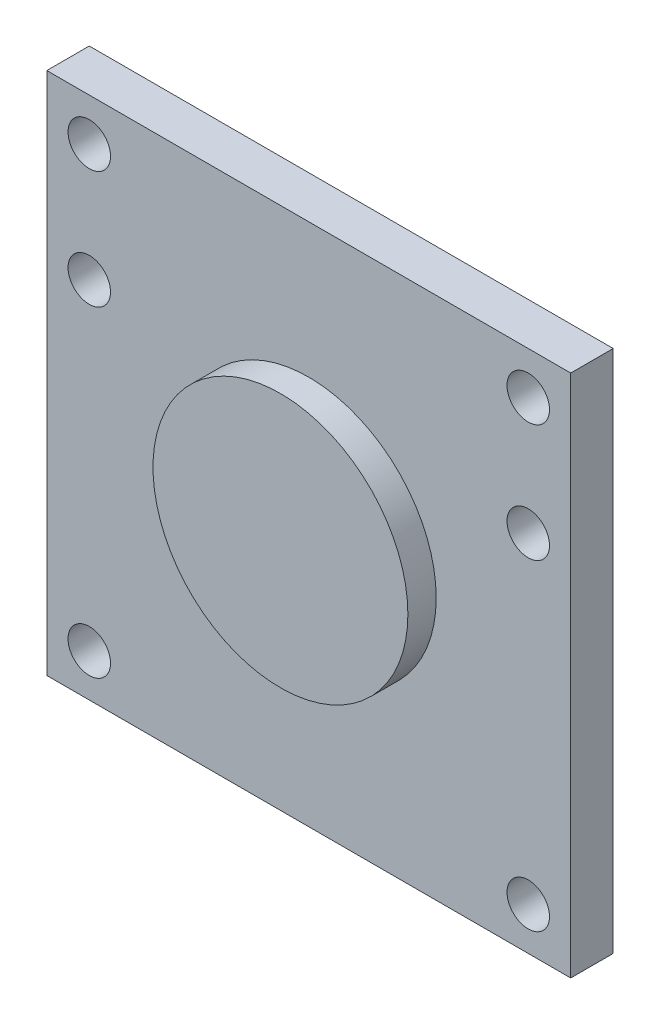
ISO-10303-21;
HEADER;
FILE_DESCRIPTION(('STEP AP214'),'2;1');
FILE_NAME('part.step','',(''),(''),'','','');
FILE_SCHEMA(('AUTOMOTIVE_DESIGN { 1 0 10303 214 1 1 1 1 }'));
ENDSEC;
DATA;
#1=APPLICATION_CONTEXT('core data for automotive mechanical design processes');
#2=APPLICATION_PROTOCOL_DEFINITION('international standard','automotive_design',2000,#1);
#3=PRODUCT_CONTEXT('',#1,'mechanical');
#4=PRODUCT('Part','Part','',(#3));
#5=PRODUCT_RELATED_PRODUCT_CATEGORY('part','',(#4));
#6=PRODUCT_DEFINITION_FORMATION('','',#4);
#7=PRODUCT_DEFINITION_CONTEXT('part definition',#1,'design');
#8=PRODUCT_DEFINITION('design','',#6,#7);
#9=PRODUCT_DEFINITION_SHAPE('','',#8);
#10=(LENGTH_UNIT() NAMED_UNIT(*) SI_UNIT(.MILLI.,.METRE.));
#11=(NAMED_UNIT(*) PLANE_ANGLE_UNIT() SI_UNIT($,.RADIAN.));
#12=(NAMED_UNIT(*) SI_UNIT($,.STERADIAN.) SOLID_ANGLE_UNIT());
#13=UNCERTAINTY_MEASURE_WITH_UNIT(LENGTH_MEASURE(1.E-05),#10,'distance_accuracy_value','');
#14=(GEOMETRIC_REPRESENTATION_CONTEXT(3) GLOBAL_UNCERTAINTY_ASSIGNED_CONTEXT((#13)) GLOBAL_UNIT_ASSIGNED_CONTEXT((#10,
#11,#12)) REPRESENTATION_CONTEXT('',''));
#15=CARTESIAN_POINT('',(0.,0.,0.));
#16=DIRECTION('',(0.,0.,1.));
#17=DIRECTION('',(1.,0.,0.));
#18=AXIS2_PLACEMENT_3D('',#15,#16,#17);
#19=CARTESIAN_POINT('',(0.,0.,3.));
#20=DIRECTION('',(0.,0.,1.));
#21=DIRECTION('',(1.,0.,0.));
#22=AXIS2_PLACEMENT_3D('',#19,#20,#21);
#23=PLANE('',#22);
#24=CARTESIAN_POINT('',(0.,0.,3.));
#25=DIRECTION('',(0.,0.,1.));
#26=DIRECTION('',(1.,0.,0.));
#27=AXIS2_PLACEMENT_3D('',#24,#25,#26);
#28=CIRCLE('',#27,9.);
#29=CARTESIAN_POINT('',(9.,0.,3.));
#30=VERTEX_POINT('',#29);
#31=EDGE_CURVE('E150',#30,#30,#28,.T.);
#32=ORIENTED_EDGE('',*,*,#31,.F.);
#33=EDGE_LOOP('',(#32));
#34=FACE_BOUND('',#33,.T.);
#35=CARTESIAN_POINT('',(15.5,-15.5,3.));
#36=DIRECTION('',(0.,0.,1.));
#37=DIRECTION('',(1.,0.,0.));
#38=AXIS2_PLACEMENT_3D('',#35,#36,#37);
#39=CIRCLE('',#38,1.5);
#40=CARTESIAN_POINT('',(17.,-15.5,3.));
#41=VERTEX_POINT('',#40);
#42=EDGE_CURVE('E135',#41,#41,#39,.T.);
#43=ORIENTED_EDGE('',*,*,#42,.F.);
#44=EDGE_LOOP('',(#43));
#45=FACE_BOUND('',#44,.T.);
#46=CARTESIAN_POINT('',(-15.5,15.5,3.));
#47=DIRECTION('',(0.,0.,1.));
#48=DIRECTION('',(1.,0.,0.));
#49=AXIS2_PLACEMENT_3D('',#46,#47,#48);
#50=CIRCLE('',#49,1.5);
#51=CARTESIAN_POINT('',(-14.,15.5,3.));
#52=VERTEX_POINT('',#51);
#53=EDGE_CURVE('E123',#52,#52,#50,.T.);
#54=ORIENTED_EDGE('',*,*,#53,.F.);
#55=EDGE_LOOP('',(#54));
#56=FACE_BOUND('',#55,.T.);
#57=CARTESIAN_POINT('',(15.5,7.2,3.));
#58=DIRECTION('',(0.,0.,1.));
#59=DIRECTION('',(1.,0.,0.));
#60=AXIS2_PLACEMENT_3D('',#57,#58,#59);
#61=CIRCLE('',#60,1.5);
#62=CARTESIAN_POINT('',(17.,7.2,3.));
#63=VERTEX_POINT('',#62);
#64=EDGE_CURVE('E102',#63,#63,#61,.T.);
#65=ORIENTED_EDGE('',*,*,#64,.F.);
#66=EDGE_LOOP('',(#65));
#67=FACE_BOUND('',#66,.T.);
#68=DIRECTION('',(0.,1.,0.));
#69=VECTOR('',#68,1.);
#70=CARTESIAN_POINT('',(18.5,18.5,3.));
#71=LINE('',#70,#69);
#72=CARTESIAN_POINT('',(18.5,-18.5,3.));
#73=VERTEX_POINT('',#72);
#74=CARTESIAN_POINT('',(18.5,18.5,3.));
#75=VERTEX_POINT('',#74);
#76=EDGE_CURVE('E87',#73,#75,#71,.T.);
#77=ORIENTED_EDGE('',*,*,#76,.T.);
#78=DIRECTION('',(-1.,0.,0.));
#79=VECTOR('',#78,1.);
#80=CARTESIAN_POINT('',(-18.5,18.5,3.));
#81=LINE('',#80,#79);
#82=CARTESIAN_POINT('',(-18.5,18.5,3.));
#83=VERTEX_POINT('',#82);
#84=EDGE_CURVE('E82',#75,#83,#81,.T.);
#85=ORIENTED_EDGE('',*,*,#84,.T.);
#86=DIRECTION('',(0.,-1.,0.));
#87=VECTOR('',#86,1.);
#88=CARTESIAN_POINT('',(-18.5,18.5,3.));
#89=LINE('',#88,#87);
#90=CARTESIAN_POINT('',(-18.5,-18.5,3.));
#91=VERTEX_POINT('',#90);
#92=EDGE_CURVE('E85',#83,#91,#89,.T.);
#93=ORIENTED_EDGE('',*,*,#92,.T.);
#94=DIRECTION('',(1.,0.,0.));
#95=VECTOR('',#94,1.);
#96=CARTESIAN_POINT('',(-18.5,-18.5,3.));
#97=LINE('',#96,#95);
#98=EDGE_CURVE('E52',#91,#73,#97,.T.);
#99=ORIENTED_EDGE('',*,*,#98,.T.);
#100=EDGE_LOOP('',(#77,#85,#93,#99));
#101=FACE_BOUND('',#100,.T.);
#102=CARTESIAN_POINT('',(-15.5,7.2,3.));
#103=DIRECTION('',(0.,0.,1.));
#104=DIRECTION('',(1.,0.,0.));
#105=AXIS2_PLACEMENT_3D('',#102,#103,#104);
#106=CIRCLE('',#105,1.5);
#107=CARTESIAN_POINT('',(-14.,7.2,3.));
#108=VERTEX_POINT('',#107);
#109=EDGE_CURVE('E117',#108,#108,#106,.T.);
#110=ORIENTED_EDGE('',*,*,#109,.F.);
#111=EDGE_LOOP('',(#110));
#112=FACE_BOUND('',#111,.T.);
#113=CARTESIAN_POINT('',(15.5,15.5,3.));
#114=DIRECTION('',(0.,0.,1.));
#115=DIRECTION('',(1.,0.,0.));
#116=AXIS2_PLACEMENT_3D('',#113,#114,#115);
#117=CIRCLE('',#116,1.5);
#118=CARTESIAN_POINT('',(17.,15.5,3.));
#119=VERTEX_POINT('',#118);
#120=EDGE_CURVE('E129',#119,#119,#117,.T.);
#121=ORIENTED_EDGE('',*,*,#120,.F.);
#122=EDGE_LOOP('',(#121));
#123=FACE_BOUND('',#122,.T.);
#124=CARTESIAN_POINT('',(-15.5,-15.5,3.));
#125=DIRECTION('',(0.,0.,1.));
#126=DIRECTION('',(1.,0.,0.));
#127=AXIS2_PLACEMENT_3D('',#124,#125,#126);
#128=CIRCLE('',#127,1.5);
#129=CARTESIAN_POINT('',(-14.,-15.5,3.));
#130=VERTEX_POINT('',#129);
#131=EDGE_CURVE('E141',#130,#130,#128,.T.);
#132=ORIENTED_EDGE('',*,*,#131,.F.);
#133=EDGE_LOOP('',(#132));
#134=FACE_BOUND('',#133,.T.);
#135=ADVANCED_FACE('F35',(#34,#45,#56,#67,#101,#112,#123,#134),#23,.T.);
#136=CARTESIAN_POINT('',(0.,0.,0.));
#137=DIRECTION('',(0.,0.,1.));
#138=DIRECTION('',(1.,0.,0.));
#139=AXIS2_PLACEMENT_3D('',#136,#137,#138);
#140=PLANE('',#139);
#141=DIRECTION('',(0.,1.,0.));
#142=VECTOR('',#141,1.);
#143=CARTESIAN_POINT('',(18.5,18.5,0.));
#144=LINE('',#143,#142);
#145=CARTESIAN_POINT('',(18.5,-18.5,0.));
#146=VERTEX_POINT('',#145);
#147=CARTESIAN_POINT('',(18.5,18.5,0.));
#148=VERTEX_POINT('',#147);
#149=EDGE_CURVE('E99',#146,#148,#144,.T.);
#150=ORIENTED_EDGE('',*,*,#149,.F.);
#151=DIRECTION('',(1.,0.,0.));
#152=VECTOR('',#151,1.);
#153=CARTESIAN_POINT('',(-18.5,-18.5,0.));
#154=LINE('',#153,#152);
#155=CARTESIAN_POINT('',(-18.5,-18.5,0.));
#156=VERTEX_POINT('',#155);
#157=EDGE_CURVE('E75',#156,#146,#154,.T.);
#158=ORIENTED_EDGE('',*,*,#157,.F.);
#159=DIRECTION('',(0.,-1.,0.));
#160=VECTOR('',#159,1.);
#161=CARTESIAN_POINT('',(-18.5,18.5,0.));
#162=LINE('',#161,#160);
#163=CARTESIAN_POINT('',(-18.5,18.5,0.));
#164=VERTEX_POINT('',#163);
#165=EDGE_CURVE('E69',#164,#156,#162,.T.);
#166=ORIENTED_EDGE('',*,*,#165,.F.);
#167=DIRECTION('',(-1.,0.,0.));
#168=VECTOR('',#167,1.);
#169=CARTESIAN_POINT('',(-18.5,18.5,0.));
#170=LINE('',#169,#168);
#171=EDGE_CURVE('E91',#148,#164,#170,.T.);
#172=ORIENTED_EDGE('',*,*,#171,.F.);
#173=EDGE_LOOP('',(#150,#158,#166,#172));
#174=FACE_BOUND('',#173,.T.);
#175=CARTESIAN_POINT('',(15.5,7.2,0.));
#176=DIRECTION('',(0.,0.,1.));
#177=DIRECTION('',(1.,0.,0.));
#178=AXIS2_PLACEMENT_3D('',#175,#176,#177);
#179=CIRCLE('',#178,1.5);
#180=CARTESIAN_POINT('',(17.,7.2,0.));
#181=VERTEX_POINT('',#180);
#182=EDGE_CURVE('E114',#181,#181,#179,.T.);
#183=ORIENTED_EDGE('',*,*,#182,.T.);
#184=EDGE_LOOP('',(#183));
#185=FACE_BOUND('',#184,.T.);
#186=CARTESIAN_POINT('',(-15.5,7.2,0.));
#187=DIRECTION('',(0.,0.,1.));
#188=DIRECTION('',(1.,0.,0.));
#189=AXIS2_PLACEMENT_3D('',#186,#187,#188);
#190=CIRCLE('',#189,1.5);
#191=CARTESIAN_POINT('',(-14.,7.2,0.));
#192=VERTEX_POINT('',#191);
#193=EDGE_CURVE('E120',#192,#192,#190,.T.);
#194=ORIENTED_EDGE('',*,*,#193,.T.);
#195=EDGE_LOOP('',(#194));
#196=FACE_BOUND('',#195,.T.);
#197=CARTESIAN_POINT('',(-15.5,15.5,0.));
#198=DIRECTION('',(0.,0.,1.));
#199=DIRECTION('',(1.,0.,0.));
#200=AXIS2_PLACEMENT_3D('',#197,#198,#199);
#201=CIRCLE('',#200,1.5);
#202=CARTESIAN_POINT('',(-14.,15.5,0.));
#203=VERTEX_POINT('',#202);
#204=EDGE_CURVE('E126',#203,#203,#201,.T.);
#205=ORIENTED_EDGE('',*,*,#204,.T.);
#206=EDGE_LOOP('',(#205));
#207=FACE_BOUND('',#206,.T.);
#208=CARTESIAN_POINT('',(15.5,15.5,0.));
#209=DIRECTION('',(0.,0.,1.));
#210=DIRECTION('',(1.,0.,0.));
#211=AXIS2_PLACEMENT_3D('',#208,#209,#210);
#212=CIRCLE('',#211,1.5);
#213=CARTESIAN_POINT('',(17.,15.5,0.));
#214=VERTEX_POINT('',#213);
#215=EDGE_CURVE('E132',#214,#214,#212,.T.);
#216=ORIENTED_EDGE('',*,*,#215,.T.);
#217=EDGE_LOOP('',(#216));
#218=FACE_BOUND('',#217,.T.);
#219=CARTESIAN_POINT('',(15.5,-15.5,0.));
#220=DIRECTION('',(0.,0.,1.));
#221=DIRECTION('',(1.,0.,0.));
#222=AXIS2_PLACEMENT_3D('',#219,#220,#221);
#223=CIRCLE('',#222,1.5);
#224=CARTESIAN_POINT('',(17.,-15.5,0.));
#225=VERTEX_POINT('',#224);
#226=EDGE_CURVE('E138',#225,#225,#223,.T.);
#227=ORIENTED_EDGE('',*,*,#226,.T.);
#228=EDGE_LOOP('',(#227));
#229=FACE_BOUND('',#228,.T.);
#230=CARTESIAN_POINT('',(-15.5,-15.5,0.));
#231=DIRECTION('',(0.,0.,1.));
#232=DIRECTION('',(1.,0.,0.));
#233=AXIS2_PLACEMENT_3D('',#230,#231,#232);
#234=CIRCLE('',#233,1.5);
#235=CARTESIAN_POINT('',(-14.,-15.5,0.));
#236=VERTEX_POINT('',#235);
#237=EDGE_CURVE('E144',#236,#236,#234,.T.);
#238=ORIENTED_EDGE('',*,*,#237,.T.);
#239=EDGE_LOOP('',(#238));
#240=FACE_BOUND('',#239,.T.);
#241=ADVANCED_FACE('F110',(#174,#185,#196,#207,#218,#229,#240),#140,.F.);
#242=CARTESIAN_POINT('',(18.5,18.5,3.));
#243=DIRECTION('',(-1.,0.,0.));
#244=DIRECTION('',(0.,0.,1.));
#245=AXIS2_PLACEMENT_3D('',#242,#243,#244);
#246=PLANE('',#245);
#247=ORIENTED_EDGE('',*,*,#149,.T.);
#248=DIRECTION('',(0.,0.,-1.));
#249=VECTOR('',#248,1.);
#250=CARTESIAN_POINT('',(18.5,18.5,3.));
#251=LINE('',#250,#249);
#252=EDGE_CURVE('E11',#75,#148,#251,.T.);
#253=ORIENTED_EDGE('',*,*,#252,.F.);
#254=ORIENTED_EDGE('',*,*,#76,.F.);
#255=DIRECTION('',(0.,0.,-1.));
#256=VECTOR('',#255,1.);
#257=CARTESIAN_POINT('',(18.5,-18.5,3.));
#258=LINE('',#257,#256);
#259=EDGE_CURVE('E95',#73,#146,#258,.T.);
#260=ORIENTED_EDGE('',*,*,#259,.T.);
#261=EDGE_LOOP('',(#247,#253,#254,#260));
#262=FACE_BOUND('',#261,.T.);
#263=ADVANCED_FACE('F37',(#262),#246,.F.);
#264=CARTESIAN_POINT('',(-18.5,18.5,3.));
#265=DIRECTION('',(0.,-1.,0.));
#266=DIRECTION('',(0.,0.,-1.));
#267=AXIS2_PLACEMENT_3D('',#264,#265,#266);
#268=PLANE('',#267);
#269=ORIENTED_EDGE('',*,*,#171,.T.);
#270=DIRECTION('',(0.,0.,-1.));
#271=VECTOR('',#270,1.);
#272=CARTESIAN_POINT('',(-18.5,18.5,3.));
#273=LINE('',#272,#271);
#274=EDGE_CURVE('E44',#83,#164,#273,.T.);
#275=ORIENTED_EDGE('',*,*,#274,.F.);
#276=ORIENTED_EDGE('',*,*,#84,.F.);
#277=ORIENTED_EDGE('',*,*,#252,.T.);
#278=EDGE_LOOP('',(#269,#275,#276,#277));
#279=FACE_BOUND('',#278,.T.);
#280=ADVANCED_FACE('F90',(#279),#268,.F.);
#281=CARTESIAN_POINT('',(-18.5,18.5,3.));
#282=DIRECTION('',(1.,0.,0.));
#283=DIRECTION('',(0.,1.,0.));
#284=AXIS2_PLACEMENT_3D('',#281,#282,#283);
#285=PLANE('',#284);
#286=ORIENTED_EDGE('',*,*,#165,.T.);
#287=DIRECTION('',(0.,0.,-1.));
#288=VECTOR('',#287,1.);
#289=CARTESIAN_POINT('',(-18.5,-18.5,3.));
#290=LINE('',#289,#288);
#291=EDGE_CURVE('E92',#91,#156,#290,.T.);
#292=ORIENTED_EDGE('',*,*,#291,.F.);
#293=ORIENTED_EDGE('',*,*,#92,.F.);
#294=ORIENTED_EDGE('',*,*,#274,.T.);
#295=EDGE_LOOP('',(#286,#292,#293,#294));
#296=FACE_BOUND('',#295,.T.);
#297=ADVANCED_FACE('F93',(#296),#285,.F.);
#298=CARTESIAN_POINT('',(-18.5,-18.5,3.));
#299=DIRECTION('',(0.,1.,0.));
#300=DIRECTION('',(0.,0.,1.));
#301=AXIS2_PLACEMENT_3D('',#298,#299,#300);
#302=PLANE('',#301);
#303=ORIENTED_EDGE('',*,*,#157,.T.);
#304=ORIENTED_EDGE('',*,*,#259,.F.);
#305=ORIENTED_EDGE('',*,*,#98,.F.);
#306=ORIENTED_EDGE('',*,*,#291,.T.);
#307=EDGE_LOOP('',(#303,#304,#305,#306));
#308=FACE_BOUND('',#307,.T.);
#309=ADVANCED_FACE('F107',(#308),#302,.F.);
#310=CARTESIAN_POINT('',(15.5,7.2,3.));
#311=DIRECTION('',(0.,0.,-1.));
#312=DIRECTION('',(-1.,0.,0.));
#313=AXIS2_PLACEMENT_3D('',#310,#311,#312);
#314=CYLINDRICAL_SURFACE('',#313,1.5);
#315=ORIENTED_EDGE('',*,*,#64,.T.);
#316=EDGE_LOOP('',(#315));
#317=FACE_BOUND('',#316,.T.);
#318=ORIENTED_EDGE('',*,*,#182,.F.);
#319=EDGE_LOOP('',(#318));
#320=FACE_BOUND('',#319,.T.);
#321=ADVANCED_FACE('F174',(#317,#320),#314,.F.);
#322=CARTESIAN_POINT('',(-15.5,7.2,3.));
#323=DIRECTION('',(0.,0.,-1.));
#324=DIRECTION('',(-1.,0.,0.));
#325=AXIS2_PLACEMENT_3D('',#322,#323,#324);
#326=CYLINDRICAL_SURFACE('',#325,1.5);
#327=ORIENTED_EDGE('',*,*,#109,.T.);
#328=EDGE_LOOP('',(#327));
#329=FACE_BOUND('',#328,.T.);
#330=ORIENTED_EDGE('',*,*,#193,.F.);
#331=EDGE_LOOP('',(#330));
#332=FACE_BOUND('',#331,.T.);
#333=ADVANCED_FACE('F177',(#329,#332),#326,.F.);
#334=CARTESIAN_POINT('',(-15.5,15.5,3.));
#335=DIRECTION('',(0.,0.,-1.));
#336=DIRECTION('',(-1.,0.,0.));
#337=AXIS2_PLACEMENT_3D('',#334,#335,#336);
#338=CYLINDRICAL_SURFACE('',#337,1.5);
#339=ORIENTED_EDGE('',*,*,#53,.T.);
#340=EDGE_LOOP('',(#339));
#341=FACE_BOUND('',#340,.T.);
#342=ORIENTED_EDGE('',*,*,#204,.F.);
#343=EDGE_LOOP('',(#342));
#344=FACE_BOUND('',#343,.T.);
#345=ADVANCED_FACE('F207',(#341,#344),#338,.F.);
#346=CARTESIAN_POINT('',(15.5,15.5,3.));
#347=DIRECTION('',(0.,0.,-1.));
#348=DIRECTION('',(-1.,0.,0.));
#349=AXIS2_PLACEMENT_3D('',#346,#347,#348);
#350=CYLINDRICAL_SURFACE('',#349,1.5);
#351=ORIENTED_EDGE('',*,*,#120,.T.);
#352=EDGE_LOOP('',(#351));
#353=FACE_BOUND('',#352,.T.);
#354=ORIENTED_EDGE('',*,*,#215,.F.);
#355=EDGE_LOOP('',(#354));
#356=FACE_BOUND('',#355,.T.);
#357=ADVANCED_FACE('F200',(#353,#356),#350,.F.);
#358=CARTESIAN_POINT('',(15.5,-15.5,3.));
#359=DIRECTION('',(0.,0.,-1.));
#360=DIRECTION('',(-1.,0.,0.));
#361=AXIS2_PLACEMENT_3D('',#358,#359,#360);
#362=CYLINDRICAL_SURFACE('',#361,1.5);
#363=ORIENTED_EDGE('',*,*,#42,.T.);
#364=EDGE_LOOP('',(#363));
#365=FACE_BOUND('',#364,.T.);
#366=ORIENTED_EDGE('',*,*,#226,.F.);
#367=EDGE_LOOP('',(#366));
#368=FACE_BOUND('',#367,.T.);
#369=ADVANCED_FACE('F194',(#365,#368),#362,.F.);
#370=CARTESIAN_POINT('',(-15.5,-15.5,3.));
#371=DIRECTION('',(0.,0.,-1.));
#372=DIRECTION('',(-1.,0.,0.));
#373=AXIS2_PLACEMENT_3D('',#370,#371,#372);
#374=CYLINDRICAL_SURFACE('',#373,1.5);
#375=ORIENTED_EDGE('',*,*,#131,.T.);
#376=EDGE_LOOP('',(#375));
#377=FACE_BOUND('',#376,.T.);
#378=ORIENTED_EDGE('',*,*,#237,.F.);
#379=EDGE_LOOP('',(#378));
#380=FACE_BOUND('',#379,.T.);
#381=ADVANCED_FACE('F161',(#377,#380),#374,.F.);
#382=CARTESIAN_POINT('',(0.,0.,5.));
#383=DIRECTION('',(0.,0.,-1.));
#384=DIRECTION('',(-1.,0.,0.));
#385=AXIS2_PLACEMENT_3D('',#382,#383,#384);
#386=CYLINDRICAL_SURFACE('',#385,9.);
#387=CARTESIAN_POINT('',(0.,0.,5.));
#388=DIRECTION('',(0.,0.,1.));
#389=DIRECTION('',(1.,0.,0.));
#390=AXIS2_PLACEMENT_3D('',#387,#388,#389);
#391=CIRCLE('',#390,9.);
#392=CARTESIAN_POINT('',(9.,0.,5.));
#393=VERTEX_POINT('',#392);
#394=EDGE_CURVE('E147',#393,#393,#391,.T.);
#395=ORIENTED_EDGE('',*,*,#394,.F.);
#396=EDGE_LOOP('',(#395));
#397=FACE_BOUND('',#396,.T.);
#398=ORIENTED_EDGE('',*,*,#31,.T.);
#399=EDGE_LOOP('',(#398));
#400=FACE_BOUND('',#399,.T.);
#401=ADVANCED_FACE('F158',(#397,#400),#386,.T.);
#402=CARTESIAN_POINT('',(0.,0.,5.));
#403=DIRECTION('',(0.,0.,1.));
#404=DIRECTION('',(1.,0.,0.));
#405=AXIS2_PLACEMENT_3D('',#402,#403,#404);
#406=PLANE('',#405);
#407=ORIENTED_EDGE('',*,*,#394,.T.);
#408=EDGE_LOOP('',(#407));
#409=FACE_BOUND('',#408,.T.);
#410=ADVANCED_FACE('F156',(#409),#406,.T.);
#411=CLOSED_SHELL('',(#135,#241,#263,#280,#297,#309,#321,#333,#345,#357,#369,#381,#401,#410));
#412=MANIFOLD_SOLID_BREP('B2',#411);
#413=ADVANCED_BREP_SHAPE_REPRESENTATION('',(#18,#412),#14);
#414=SHAPE_DEFINITION_REPRESENTATION(#9,#413);
ENDSEC;
END-ISO-10303-21;
